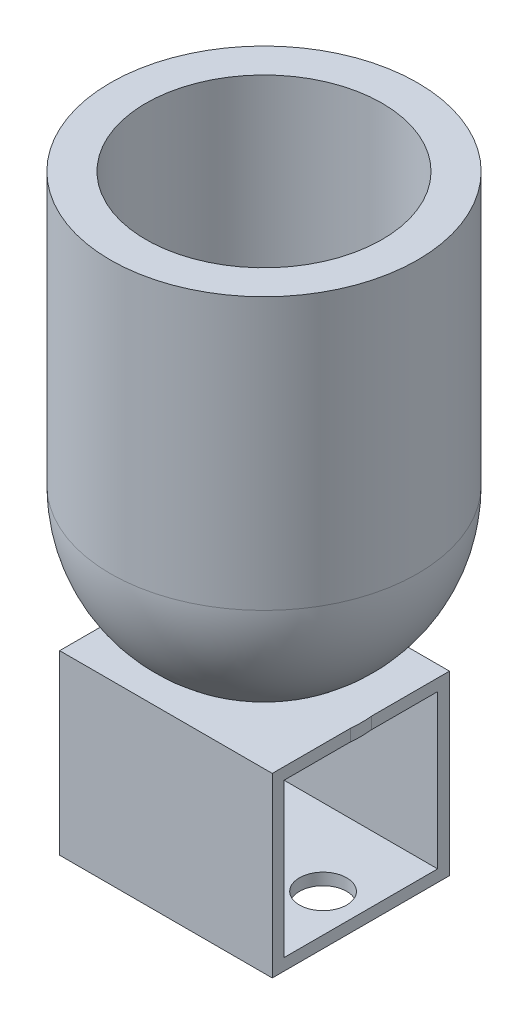
ISO-10303-21;
HEADER;
FILE_DESCRIPTION(('STEP AP214'),'2;1');
FILE_NAME('part.step','',(''),(''),'','','');
FILE_SCHEMA(('AUTOMOTIVE_DESIGN { 1 0 10303 214 1 1 1 1 }'));
ENDSEC;
DATA;
#1=APPLICATION_CONTEXT('core data for automotive mechanical design processes');
#2=APPLICATION_PROTOCOL_DEFINITION('international standard','automotive_design',2000,#1);
#3=PRODUCT_CONTEXT('',#1,'mechanical');
#4=PRODUCT('Part','Part','',(#3));
#5=PRODUCT_RELATED_PRODUCT_CATEGORY('part','',(#4));
#6=PRODUCT_DEFINITION_FORMATION('','',#4);
#7=PRODUCT_DEFINITION_CONTEXT('part definition',#1,'design');
#8=PRODUCT_DEFINITION('design','',#6,#7);
#9=PRODUCT_DEFINITION_SHAPE('','',#8);
#10=(LENGTH_UNIT() NAMED_UNIT(*) SI_UNIT(.MILLI.,.METRE.));
#11=(NAMED_UNIT(*) PLANE_ANGLE_UNIT() SI_UNIT($,.RADIAN.));
#12=(NAMED_UNIT(*) SI_UNIT($,.STERADIAN.) SOLID_ANGLE_UNIT());
#13=UNCERTAINTY_MEASURE_WITH_UNIT(LENGTH_MEASURE(1.E-05),#10,'distance_accuracy_value','');
#14=(GEOMETRIC_REPRESENTATION_CONTEXT(3) GLOBAL_UNCERTAINTY_ASSIGNED_CONTEXT((#13)) GLOBAL_UNIT_ASSIGNED_CONTEXT((#10,
#11,#12)) REPRESENTATION_CONTEXT('',''));
#15=CARTESIAN_POINT('',(0.,0.,0.));
#16=DIRECTION('',(0.,0.,1.));
#17=DIRECTION('',(1.,0.,0.));
#18=AXIS2_PLACEMENT_3D('',#15,#16,#17);
#19=CARTESIAN_POINT('',(0.,0.,0.));
#20=DIRECTION('',(0.,-1.,0.));
#21=DIRECTION('',(0.,0.,-1.));
#22=AXIS2_PLACEMENT_3D('',#19,#20,#21);
#23=CYLINDRICAL_SURFACE('',#22,8.2476041532373);
#24=CARTESIAN_POINT('',(0.,-9.12431284714318,0.));
#25=DIRECTION('',(0.,1.,0.));
#26=DIRECTION('',(0.,0.,1.));
#27=AXIS2_PLACEMENT_3D('',#24,#25,#26);
#28=CIRCLE('',#27,8.2476041532373);
#29=CARTESIAN_POINT('',(8.20010557357962,-9.12431284714318,-0.883879432188361));
#30=VERTEX_POINT('',#29);
#31=CARTESIAN_POINT('',(8.20010557357962,-9.12431284714318,0.883879432188352));
#32=VERTEX_POINT('',#31);
#33=EDGE_CURVE('E61',#30,#32,#28,.F.);
#34=ORIENTED_EDGE('',*,*,#33,.F.);
#35=DIRECTION('',(0.,-1.,0.));
#36=VECTOR('',#35,1.);
#37=CARTESIAN_POINT('',(8.20010557357962,0.,-0.883879432188352));
#38=LINE('',#37,#36);
#39=CARTESIAN_POINT('',(8.20010557357962,-8.12431284714318,-0.883879432188354));
#40=VERTEX_POINT('',#39);
#41=EDGE_CURVE('E219',#40,#30,#38,.T.);
#42=ORIENTED_EDGE('',*,*,#41,.F.);
#43=CARTESIAN_POINT('',(0.,-8.12431284714318,0.));
#44=DIRECTION('',(0.,-1.,0.));
#45=DIRECTION('',(0.,0.,-1.));
#46=AXIS2_PLACEMENT_3D('',#43,#44,#45);
#47=CIRCLE('',#46,8.2476041532373);
#48=CARTESIAN_POINT('',(8.20010557357962,-8.12431284714318,0.883879432188351));
#49=VERTEX_POINT('',#48);
#50=EDGE_CURVE('E230',#40,#49,#47,.T.);
#51=ORIENTED_EDGE('',*,*,#50,.T.);
#52=DIRECTION('',(0.,-1.,0.));
#53=VECTOR('',#52,1.);
#54=CARTESIAN_POINT('',(8.20010557357962,0.,0.883879432188352));
#55=LINE('',#54,#53);
#56=EDGE_CURVE('E223',#32,#49,#55,.F.);
#57=ORIENTED_EDGE('',*,*,#56,.F.);
#58=EDGE_LOOP('',(#34,#42,#51,#57));
#59=FACE_BOUND('',#58,.T.);
#60=ADVANCED_FACE('F43',(#59),#23,.T.);
#61=CARTESIAN_POINT('',(0.,0.,0.));
#62=DIRECTION('',(0.,-1.,0.));
#63=DIRECTION('',(0.,0.,-1.));
#64=AXIS2_PLACEMENT_3D('',#61,#62,#63);
#65=CYLINDRICAL_SURFACE('',#64,2.);
#66=CARTESIAN_POINT('',(0.,-7.68014500949305,0.));
#67=DIRECTION('',(0.,-1.,0.));
#68=DIRECTION('',(0.,0.,-1.));
#69=AXIS2_PLACEMENT_3D('',#66,#67,#68);
#70=CIRCLE('',#69,2.);
#71=CARTESIAN_POINT('',(0.,-7.68014500949305,-2.));
#72=VERTEX_POINT('',#71);
#73=EDGE_CURVE('E11',#72,#72,#70,.T.);
#74=ORIENTED_EDGE('',*,*,#73,.T.);
#75=EDGE_LOOP('',(#74));
#76=FACE_BOUND('',#75,.T.);
#77=CARTESIAN_POINT('',(0.,-8.12431284714318,0.));
#78=DIRECTION('',(0.,-1.,0.));
#79=DIRECTION('',(0.,0.,-1.));
#80=AXIS2_PLACEMENT_3D('',#77,#78,#79);
#81=CIRCLE('',#80,2.);
#82=CARTESIAN_POINT('',(0.,-8.12431284714318,-2.));
#83=VERTEX_POINT('',#82);
#84=EDGE_CURVE('E226',#83,#83,#81,.T.);
#85=ORIENTED_EDGE('',*,*,#84,.F.);
#86=EDGE_LOOP('',(#85));
#87=FACE_BOUND('',#86,.T.);
#88=ADVANCED_FACE('F45',(#76,#87),#65,.T.);
#89=CARTESIAN_POINT('',(0.,5.16508756917208,0.));
#90=DIRECTION('',(0.,-1.,0.));
#91=DIRECTION('',(1.,0.,0.));
#92=AXIS2_PLACEMENT_3D('',#89,#90,#91);
#93=SPHERICAL_SURFACE('',#92,13.);
#94=CARTESIAN_POINT('',(0.,5.16508756917208,0.));
#95=DIRECTION('',(0.,-1.,0.));
#96=DIRECTION('',(0.,0.,-1.));
#97=AXIS2_PLACEMENT_3D('',#94,#95,#96);
#98=CIRCLE('',#97,13.);
#99=CARTESIAN_POINT('',(0.,5.16508756917208,-13.));
#100=VERTEX_POINT('',#99);
#101=EDGE_CURVE('E53',#100,#100,#98,.T.);
#102=ORIENTED_EDGE('',*,*,#101,.T.);
#103=EDGE_LOOP('',(#102));
#104=FACE_BOUND('',#103,.T.);
#105=ORIENTED_EDGE('',*,*,#73,.F.);
#106=EDGE_LOOP('',(#105));
#107=FACE_BOUND('',#106,.T.);
#108=ADVANCED_FACE('F322',(#104,#107),#93,.T.);
#109=CARTESIAN_POINT('',(0.,0.,0.));
#110=DIRECTION('',(0.,-1.,0.));
#111=DIRECTION('',(0.,0.,-1.));
#112=AXIS2_PLACEMENT_3D('',#109,#110,#111);
#113=CYLINDRICAL_SURFACE('',#112,13.);
#114=CARTESIAN_POINT('',(0.,28.1650875691721,0.));
#115=DIRECTION('',(0.,-1.,0.));
#116=DIRECTION('',(0.,0.,-1.));
#117=AXIS2_PLACEMENT_3D('',#114,#115,#116);
#118=CIRCLE('',#117,13.);
#119=CARTESIAN_POINT('',(0.,28.1650875691721,-13.));
#120=VERTEX_POINT('',#119);
#121=EDGE_CURVE('E242',#120,#120,#118,.T.);
#122=ORIENTED_EDGE('',*,*,#121,.T.);
#123=EDGE_LOOP('',(#122));
#124=FACE_BOUND('',#123,.T.);
#125=ORIENTED_EDGE('',*,*,#101,.F.);
#126=EDGE_LOOP('',(#125));
#127=FACE_BOUND('',#126,.T.);
#128=ADVANCED_FACE('F338',(#124,#127),#113,.T.);
#129=CARTESIAN_POINT('',(13.,28.1650875691721,0.));
#130=DIRECTION('',(0.,1.,0.));
#131=DIRECTION('',(0.,0.,1.));
#132=AXIS2_PLACEMENT_3D('',#129,#130,#131);
#133=PLANE('',#132);
#134=CARTESIAN_POINT('',(0.,28.1650875691721,0.));
#135=DIRECTION('',(0.,-1.,0.));
#136=DIRECTION('',(0.,0.,-1.));
#137=AXIS2_PLACEMENT_3D('',#134,#135,#136);
#138=CIRCLE('',#137,10.);
#139=CARTESIAN_POINT('',(0.,28.1650875691721,-10.));
#140=VERTEX_POINT('',#139);
#141=EDGE_CURVE('E238',#140,#140,#138,.T.);
#142=ORIENTED_EDGE('',*,*,#141,.T.);
#143=EDGE_LOOP('',(#142));
#144=FACE_BOUND('',#143,.T.);
#145=ORIENTED_EDGE('',*,*,#121,.F.);
#146=EDGE_LOOP('',(#145));
#147=FACE_BOUND('',#146,.T.);
#148=ADVANCED_FACE('F334',(#144,#147),#133,.T.);
#149=CARTESIAN_POINT('',(0.,0.,0.));
#150=DIRECTION('',(0.,-1.,0.));
#151=DIRECTION('',(0.,0.,-1.));
#152=AXIS2_PLACEMENT_3D('',#149,#150,#151);
#153=CYLINDRICAL_SURFACE('',#152,10.);
#154=CARTESIAN_POINT('',(0.,5.16508756917208,0.));
#155=DIRECTION('',(0.,-1.,0.));
#156=DIRECTION('',(0.,0.,-1.));
#157=AXIS2_PLACEMENT_3D('',#154,#155,#156);
#158=CIRCLE('',#157,10.);
#159=CARTESIAN_POINT('',(0.,5.16508756917208,-10.));
#160=VERTEX_POINT('',#159);
#161=EDGE_CURVE('E234',#160,#160,#158,.T.);
#162=ORIENTED_EDGE('',*,*,#161,.T.);
#163=EDGE_LOOP('',(#162));
#164=FACE_BOUND('',#163,.T.);
#165=ORIENTED_EDGE('',*,*,#141,.F.);
#166=EDGE_LOOP('',(#165));
#167=FACE_BOUND('',#166,.T.);
#168=ADVANCED_FACE('F330',(#164,#167),#153,.F.);
#169=CARTESIAN_POINT('',(0.,5.16508756917208,0.));
#170=DIRECTION('',(0.,-1.,0.));
#171=DIRECTION('',(1.,0.,0.));
#172=AXIS2_PLACEMENT_3D('',#169,#170,#171);
#173=SPHERICAL_SURFACE('',#172,10.);
#174=ORIENTED_EDGE('',*,*,#161,.F.);
#175=EDGE_LOOP('',(#174));
#176=FACE_BOUND('',#175,.T.);
#177=ADVANCED_FACE('F327',(#176),#173,.F.);
#178=CARTESIAN_POINT('',(2.,-8.12431284714318,0.));
#179=DIRECTION('',(0.,1.,0.));
#180=DIRECTION('',(0.,0.,1.));
#181=AXIS2_PLACEMENT_3D('',#178,#179,#180);
#182=PLANE('',#181);
#183=DIRECTION('',(0.,0.,1.));
#184=VECTOR('',#183,1.);
#185=CARTESIAN_POINT('',(8.20010557357962,-8.12431284714318,-6.5));
#186=LINE('',#185,#184);
#187=CARTESIAN_POINT('',(8.20010557357962,-8.12431284714318,-7.5));
#188=VERTEX_POINT('',#187);
#189=EDGE_CURVE('E216',#188,#40,#186,.T.);
#190=ORIENTED_EDGE('',*,*,#189,.F.);
#191=DIRECTION('',(1.,0.,0.));
#192=VECTOR('',#191,1.);
#193=CARTESIAN_POINT('',(-9.79989442642037,-8.12431284714318,-7.5));
#194=LINE('',#193,#192);
#195=CARTESIAN_POINT('',(-9.79989442642037,-8.12431284714318,-7.5));
#196=VERTEX_POINT('',#195);
#197=EDGE_CURVE('E210',#196,#188,#194,.T.);
#198=ORIENTED_EDGE('',*,*,#197,.F.);
#199=DIRECTION('',(0.,0.,-1.));
#200=VECTOR('',#199,1.);
#201=CARTESIAN_POINT('',(-9.79989442642037,-8.12431284714318,7.5));
#202=LINE('',#201,#200);
#203=CARTESIAN_POINT('',(-9.79989442642037,-8.12431284714318,7.5));
#204=VERTEX_POINT('',#203);
#205=EDGE_CURVE('E184',#204,#196,#202,.T.);
#206=ORIENTED_EDGE('',*,*,#205,.F.);
#207=DIRECTION('',(1.,0.,0.));
#208=VECTOR('',#207,1.);
#209=CARTESIAN_POINT('',(-9.79989442642037,-8.12431284714318,7.5));
#210=LINE('',#209,#208);
#211=CARTESIAN_POINT('',(8.20010557357962,-8.12431284714318,7.5));
#212=VERTEX_POINT('',#211);
#213=EDGE_CURVE('E206',#204,#212,#210,.T.);
#214=ORIENTED_EDGE('',*,*,#213,.T.);
#215=EDGE_CURVE('E205',#49,#212,#186,.T.);
#216=ORIENTED_EDGE('',*,*,#215,.F.);
#217=ORIENTED_EDGE('',*,*,#50,.F.);
#218=EDGE_LOOP('',(#190,#198,#206,#214,#216,#217));
#219=FACE_BOUND('',#218,.T.);
#220=ORIENTED_EDGE('',*,*,#84,.T.);
#221=EDGE_LOOP('',(#220));
#222=FACE_BOUND('',#221,.T.);
#223=ADVANCED_FACE('F297',(#219,#222),#182,.T.);
#224=CARTESIAN_POINT('',(8.20010557357962,-8.12431284714318,-6.5));
#225=DIRECTION('',(1.,0.,0.));
#226=DIRECTION('',(0.,0.,-1.));
#227=AXIS2_PLACEMENT_3D('',#224,#225,#226);
#228=PLANE('',#227);
#229=DIRECTION('',(0.,0.,1.));
#230=VECTOR('',#229,1.);
#231=CARTESIAN_POINT('',(8.20010557357962,-9.12431284714318,-6.5));
#232=LINE('',#231,#230);
#233=CARTESIAN_POINT('',(8.20010557357962,-9.12431284714318,-6.5));
#234=VERTEX_POINT('',#233);
#235=EDGE_CURVE('E164',#234,#30,#232,.T.);
#236=ORIENTED_EDGE('',*,*,#235,.F.);
#237=DIRECTION('',(0.,1.,0.));
#238=VECTOR('',#237,1.);
#239=CARTESIAN_POINT('',(8.20010557357962,-8.12431284714318,-6.5));
#240=LINE('',#239,#238);
#241=CARTESIAN_POINT('',(8.20010557357962,-22.1243128471432,-6.5));
#242=VERTEX_POINT('',#241);
#243=EDGE_CURVE('E132',#242,#234,#240,.T.);
#244=ORIENTED_EDGE('',*,*,#243,.F.);
#245=DIRECTION('',(0.,0.,-1.));
#246=VECTOR('',#245,1.);
#247=CARTESIAN_POINT('',(8.20010557357962,-22.1243128471432,-6.5));
#248=LINE('',#247,#246);
#249=CARTESIAN_POINT('',(8.20010557357962,-22.1243128471432,6.5));
#250=VERTEX_POINT('',#249);
#251=EDGE_CURVE('E169',#250,#242,#248,.T.);
#252=ORIENTED_EDGE('',*,*,#251,.F.);
#253=DIRECTION('',(0.,-1.,0.));
#254=VECTOR('',#253,1.);
#255=CARTESIAN_POINT('',(8.20010557357962,-8.12431284714318,6.5));
#256=LINE('',#255,#254);
#257=CARTESIAN_POINT('',(8.20010557357962,-9.12431284714318,6.5));
#258=VERTEX_POINT('',#257);
#259=EDGE_CURVE('E172',#258,#250,#256,.T.);
#260=ORIENTED_EDGE('',*,*,#259,.F.);
#261=EDGE_CURVE('E157',#32,#258,#232,.T.);
#262=ORIENTED_EDGE('',*,*,#261,.F.);
#263=ORIENTED_EDGE('',*,*,#56,.T.);
#264=ORIENTED_EDGE('',*,*,#215,.T.);
#265=DIRECTION('',(0.,-1.,0.));
#266=VECTOR('',#265,1.);
#267=CARTESIAN_POINT('',(8.20010557357962,-8.12431284714318,7.5));
#268=LINE('',#267,#266);
#269=CARTESIAN_POINT('',(8.20010557357962,-23.1243128471432,7.5));
#270=VERTEX_POINT('',#269);
#271=EDGE_CURVE('E181',#212,#270,#268,.T.);
#272=ORIENTED_EDGE('',*,*,#271,.T.);
#273=DIRECTION('',(0.,0.,-1.));
#274=VECTOR('',#273,1.);
#275=CARTESIAN_POINT('',(8.20010557357962,-23.1243128471432,7.5));
#276=LINE('',#275,#274);
#277=CARTESIAN_POINT('',(8.20010557357962,-23.1243128471432,-7.5));
#278=VERTEX_POINT('',#277);
#279=EDGE_CURVE('E175',#270,#278,#276,.T.);
#280=ORIENTED_EDGE('',*,*,#279,.T.);
#281=DIRECTION('',(0.,-1.,0.));
#282=VECTOR('',#281,1.);
#283=CARTESIAN_POINT('',(8.20010557357962,-8.12431284714318,-7.5));
#284=LINE('',#283,#282);
#285=EDGE_CURVE('E195',#188,#278,#284,.T.);
#286=ORIENTED_EDGE('',*,*,#285,.F.);
#287=ORIENTED_EDGE('',*,*,#189,.T.);
#288=ORIENTED_EDGE('',*,*,#41,.T.);
#289=EDGE_LOOP('',(#236,#244,#252,#260,#262,#263,#264,#272,#280,#286,#287,#288));
#290=FACE_BOUND('',#289,.T.);
#291=ADVANCED_FACE('F275',(#290),#228,.T.);
#292=CARTESIAN_POINT('',(-9.79989442642037,-23.1243128471432,7.5));
#293=DIRECTION('',(0.,-1.,0.));
#294=DIRECTION('',(0.,0.,-1.));
#295=AXIS2_PLACEMENT_3D('',#292,#293,#294);
#296=PLANE('',#295);
#297=CARTESIAN_POINT('',(-5.,-23.1243128471432,0.));
#298=DIRECTION('',(0.,-1.,0.));
#299=DIRECTION('',(0.,0.,-1.));
#300=AXIS2_PLACEMENT_3D('',#297,#298,#299);
#301=CIRCLE('',#300,2.);
#302=CARTESIAN_POINT('',(-5.,-23.1243128471432,-2.));
#303=VERTEX_POINT('',#302);
#304=EDGE_CURVE('E251',#303,#303,#301,.T.);
#305=ORIENTED_EDGE('',*,*,#304,.F.);
#306=EDGE_LOOP('',(#305));
#307=FACE_BOUND('',#306,.T.);
#308=CARTESIAN_POINT('',(5.,-23.1243128471432,0.));
#309=DIRECTION('',(0.,-1.,0.));
#310=DIRECTION('',(0.,0.,-1.));
#311=AXIS2_PLACEMENT_3D('',#308,#309,#310);
#312=CIRCLE('',#311,2.);
#313=CARTESIAN_POINT('',(5.,-23.1243128471432,-2.));
#314=VERTEX_POINT('',#313);
#315=EDGE_CURVE('E258',#314,#314,#312,.T.);
#316=ORIENTED_EDGE('',*,*,#315,.F.);
#317=EDGE_LOOP('',(#316));
#318=FACE_BOUND('',#317,.T.);
#319=ORIENTED_EDGE('',*,*,#279,.F.);
#320=DIRECTION('',(1.,0.,0.));
#321=VECTOR('',#320,1.);
#322=CARTESIAN_POINT('',(-9.79989442642037,-23.1243128471432,7.5));
#323=LINE('',#322,#321);
#324=CARTESIAN_POINT('',(-9.79989442642037,-23.1243128471432,7.5));
#325=VERTEX_POINT('',#324);
#326=EDGE_CURVE('E202',#325,#270,#323,.T.);
#327=ORIENTED_EDGE('',*,*,#326,.F.);
#328=DIRECTION('',(0.,0.,-1.));
#329=VECTOR('',#328,1.);
#330=CARTESIAN_POINT('',(-9.79989442642037,-23.1243128471432,7.5));
#331=LINE('',#330,#329);
#332=CARTESIAN_POINT('',(-9.79989442642037,-23.1243128471432,-7.5));
#333=VERTEX_POINT('',#332);
#334=EDGE_CURVE('E176',#325,#333,#331,.T.);
#335=ORIENTED_EDGE('',*,*,#334,.T.);
#336=DIRECTION('',(1.,0.,0.));
#337=VECTOR('',#336,1.);
#338=CARTESIAN_POINT('',(-9.79989442642037,-23.1243128471432,-7.5));
#339=LINE('',#338,#337);
#340=EDGE_CURVE('E191',#333,#278,#339,.T.);
#341=ORIENTED_EDGE('',*,*,#340,.T.);
#342=EDGE_LOOP('',(#319,#327,#335,#341));
#343=FACE_BOUND('',#342,.T.);
#344=ADVANCED_FACE('F271',(#307,#318,#343),#296,.T.);
#345=CARTESIAN_POINT('',(-9.79989442642037,-8.12431284714318,7.5));
#346=DIRECTION('',(0.,0.,1.));
#347=DIRECTION('',(0.,-1.,0.));
#348=AXIS2_PLACEMENT_3D('',#345,#346,#347);
#349=PLANE('',#348);
#350=ORIENTED_EDGE('',*,*,#271,.F.);
#351=ORIENTED_EDGE('',*,*,#213,.F.);
#352=DIRECTION('',(0.,-1.,0.));
#353=VECTOR('',#352,1.);
#354=CARTESIAN_POINT('',(-9.79989442642037,-8.12431284714318,7.5));
#355=LINE('',#354,#353);
#356=EDGE_CURVE('E187',#204,#325,#355,.T.);
#357=ORIENTED_EDGE('',*,*,#356,.T.);
#358=ORIENTED_EDGE('',*,*,#326,.T.);
#359=EDGE_LOOP('',(#350,#351,#357,#358));
#360=FACE_BOUND('',#359,.T.);
#361=ADVANCED_FACE('F274',(#360),#349,.T.);
#362=CARTESIAN_POINT('',(-9.79989442642037,-8.12431284714318,-7.5));
#363=DIRECTION('',(0.,0.,1.));
#364=DIRECTION('',(1.,0.,0.));
#365=AXIS2_PLACEMENT_3D('',#362,#363,#364);
#366=PLANE('',#365);
#367=ORIENTED_EDGE('',*,*,#285,.T.);
#368=ORIENTED_EDGE('',*,*,#340,.F.);
#369=DIRECTION('',(0.,-1.,0.));
#370=VECTOR('',#369,1.);
#371=CARTESIAN_POINT('',(-9.79989442642037,-8.12431284714318,-7.5));
#372=LINE('',#371,#370);
#373=EDGE_CURVE('E180',#196,#333,#372,.T.);
#374=ORIENTED_EDGE('',*,*,#373,.F.);
#375=ORIENTED_EDGE('',*,*,#197,.T.);
#376=EDGE_LOOP('',(#367,#368,#374,#375));
#377=FACE_BOUND('',#376,.T.);
#378=ADVANCED_FACE('F291',(#377),#366,.F.);
#379=CARTESIAN_POINT('',(-9.79989442642037,0.,0.));
#380=DIRECTION('',(-1.,0.,0.));
#381=DIRECTION('',(0.,0.,1.));
#382=AXIS2_PLACEMENT_3D('',#379,#380,#381);
#383=PLANE('',#382);
#384=DIRECTION('',(0.,1.,0.));
#385=VECTOR('',#384,1.);
#386=CARTESIAN_POINT('',(-9.79989442642037,-22.1243128471432,6.5));
#387=LINE('',#386,#385);
#388=CARTESIAN_POINT('',(-9.79989442642037,-22.1243128471432,6.5));
#389=VERTEX_POINT('',#388);
#390=CARTESIAN_POINT('',(-9.79989442642037,-9.12431284714318,6.5));
#391=VERTEX_POINT('',#390);
#392=EDGE_CURVE('E69',#389,#391,#387,.T.);
#393=ORIENTED_EDGE('',*,*,#392,.F.);
#394=DIRECTION('',(0.,0.,1.));
#395=VECTOR('',#394,1.);
#396=CARTESIAN_POINT('',(-9.79989442642037,-22.1243128471432,-6.5));
#397=LINE('',#396,#395);
#398=CARTESIAN_POINT('',(-9.79989442642037,-22.1243128471432,-6.5));
#399=VERTEX_POINT('',#398);
#400=EDGE_CURVE('E147',#399,#389,#397,.T.);
#401=ORIENTED_EDGE('',*,*,#400,.F.);
#402=DIRECTION('',(0.,-1.,0.));
#403=VECTOR('',#402,1.);
#404=CARTESIAN_POINT('',(-9.79989442642037,-22.1243128471432,-6.5));
#405=LINE('',#404,#403);
#406=CARTESIAN_POINT('',(-9.79989442642037,-9.12431284714318,-6.5));
#407=VERTEX_POINT('',#406);
#408=EDGE_CURVE('E129',#407,#399,#405,.T.);
#409=ORIENTED_EDGE('',*,*,#408,.F.);
#410=DIRECTION('',(0.,0.,-1.));
#411=VECTOR('',#410,1.);
#412=CARTESIAN_POINT('',(-9.79989442642037,-9.12431284714318,-6.5));
#413=LINE('',#412,#411);
#414=EDGE_CURVE('E139',#391,#407,#413,.T.);
#415=ORIENTED_EDGE('',*,*,#414,.F.);
#416=EDGE_LOOP('',(#393,#401,#409,#415));
#417=FACE_BOUND('',#416,.T.);
#418=ORIENTED_EDGE('',*,*,#334,.F.);
#419=ORIENTED_EDGE('',*,*,#356,.F.);
#420=ORIENTED_EDGE('',*,*,#205,.T.);
#421=ORIENTED_EDGE('',*,*,#373,.T.);
#422=EDGE_LOOP('',(#418,#419,#420,#421));
#423=FACE_BOUND('',#422,.T.);
#424=ADVANCED_FACE('F144',(#417,#423),#383,.T.);
#425=CARTESIAN_POINT('',(10.2001055735796,-22.1243128471432,6.5));
#426=DIRECTION('',(0.,0.,1.));
#427=DIRECTION('',(1.,0.,0.));
#428=AXIS2_PLACEMENT_3D('',#425,#426,#427);
#429=PLANE('',#428);
#430=ORIENTED_EDGE('',*,*,#259,.T.);
#431=DIRECTION('',(-1.,0.,0.));
#432=VECTOR('',#431,1.);
#433=CARTESIAN_POINT('',(10.2001055735796,-22.1243128471432,6.5));
#434=LINE('',#433,#432);
#435=EDGE_CURVE('E154',#250,#389,#434,.T.);
#436=ORIENTED_EDGE('',*,*,#435,.T.);
#437=ORIENTED_EDGE('',*,*,#392,.T.);
#438=DIRECTION('',(-1.,0.,0.));
#439=VECTOR('',#438,1.);
#440=CARTESIAN_POINT('',(10.2001055735796,-9.12431284714318,6.5));
#441=LINE('',#440,#439);
#442=EDGE_CURVE('E136',#258,#391,#441,.T.);
#443=ORIENTED_EDGE('',*,*,#442,.F.);
#444=EDGE_LOOP('',(#430,#436,#437,#443));
#445=FACE_BOUND('',#444,.T.);
#446=ADVANCED_FACE('F306',(#445),#429,.F.);
#447=CARTESIAN_POINT('',(10.2001055735796,-22.1243128471432,-6.5));
#448=DIRECTION('',(0.,-1.,0.));
#449=DIRECTION('',(0.,0.,-1.));
#450=AXIS2_PLACEMENT_3D('',#447,#448,#449);
#451=PLANE('',#450);
#452=CARTESIAN_POINT('',(-5.,-22.1243128471432,0.));
#453=DIRECTION('',(0.,-1.,0.));
#454=DIRECTION('',(0.,0.,-1.));
#455=AXIS2_PLACEMENT_3D('',#452,#453,#454);
#456=CIRCLE('',#455,2.);
#457=CARTESIAN_POINT('',(-5.,-22.1243128471432,-2.));
#458=VERTEX_POINT('',#457);
#459=EDGE_CURVE('E47',#458,#458,#456,.T.);
#460=ORIENTED_EDGE('',*,*,#459,.T.);
#461=EDGE_LOOP('',(#460));
#462=FACE_BOUND('',#461,.T.);
#463=CARTESIAN_POINT('',(5.,-22.1243128471432,0.));
#464=DIRECTION('',(0.,-1.,0.));
#465=DIRECTION('',(0.,0.,-1.));
#466=AXIS2_PLACEMENT_3D('',#463,#464,#465);
#467=CIRCLE('',#466,2.);
#468=CARTESIAN_POINT('',(5.,-22.1243128471432,-2.));
#469=VERTEX_POINT('',#468);
#470=EDGE_CURVE('E248',#469,#469,#467,.T.);
#471=ORIENTED_EDGE('',*,*,#470,.T.);
#472=EDGE_LOOP('',(#471));
#473=FACE_BOUND('',#472,.T.);
#474=ORIENTED_EDGE('',*,*,#251,.T.);
#475=DIRECTION('',(-1.,0.,0.));
#476=VECTOR('',#475,1.);
#477=CARTESIAN_POINT('',(10.2001055735796,-22.1243128471432,-6.5));
#478=LINE('',#477,#476);
#479=EDGE_CURVE('E135',#242,#399,#478,.T.);
#480=ORIENTED_EDGE('',*,*,#479,.T.);
#481=ORIENTED_EDGE('',*,*,#400,.T.);
#482=ORIENTED_EDGE('',*,*,#435,.F.);
#483=EDGE_LOOP('',(#474,#480,#481,#482));
#484=FACE_BOUND('',#483,.T.);
#485=ADVANCED_FACE('F305',(#462,#473,#484),#451,.F.);
#486=CARTESIAN_POINT('',(10.2001055735796,-22.1243128471432,-6.5));
#487=DIRECTION('',(0.,0.,-1.));
#488=DIRECTION('',(-1.,0.,0.));
#489=AXIS2_PLACEMENT_3D('',#486,#487,#488);
#490=PLANE('',#489);
#491=ORIENTED_EDGE('',*,*,#243,.T.);
#492=DIRECTION('',(-1.,0.,0.));
#493=VECTOR('',#492,1.);
#494=CARTESIAN_POINT('',(10.2001055735796,-9.12431284714318,-6.5));
#495=LINE('',#494,#493);
#496=EDGE_CURVE('E124',#234,#407,#495,.T.);
#497=ORIENTED_EDGE('',*,*,#496,.T.);
#498=ORIENTED_EDGE('',*,*,#408,.T.);
#499=ORIENTED_EDGE('',*,*,#479,.F.);
#500=EDGE_LOOP('',(#491,#497,#498,#499));
#501=FACE_BOUND('',#500,.T.);
#502=ADVANCED_FACE('F126',(#501),#490,.F.);
#503=CARTESIAN_POINT('',(10.2001055735796,-9.12431284714318,-6.5));
#504=DIRECTION('',(0.,1.,0.));
#505=DIRECTION('',(0.,0.,1.));
#506=AXIS2_PLACEMENT_3D('',#503,#504,#505);
#507=PLANE('',#506);
#508=ORIENTED_EDGE('',*,*,#235,.T.);
#509=ORIENTED_EDGE('',*,*,#33,.T.);
#510=ORIENTED_EDGE('',*,*,#261,.T.);
#511=ORIENTED_EDGE('',*,*,#442,.T.);
#512=ORIENTED_EDGE('',*,*,#414,.T.);
#513=ORIENTED_EDGE('',*,*,#496,.F.);
#514=EDGE_LOOP('',(#508,#509,#510,#511,#512,#513));
#515=FACE_BOUND('',#514,.T.);
#516=ADVANCED_FACE('F140',(#515),#507,.F.);
#517=CARTESIAN_POINT('',(5.,-18.1243128471432,0.));
#518=DIRECTION('',(0.,-1.,0.));
#519=DIRECTION('',(0.,0.,-1.));
#520=AXIS2_PLACEMENT_3D('',#517,#518,#519);
#521=CYLINDRICAL_SURFACE('',#520,2.);
#522=ORIENTED_EDGE('',*,*,#315,.T.);
#523=EDGE_LOOP('',(#522));
#524=FACE_BOUND('',#523,.T.);
#525=ORIENTED_EDGE('',*,*,#470,.F.);
#526=EDGE_LOOP('',(#525));
#527=FACE_BOUND('',#526,.T.);
#528=ADVANCED_FACE('F268',(#524,#527),#521,.F.);
#529=CARTESIAN_POINT('',(-5.,-18.1243128471432,0.));
#530=DIRECTION('',(0.,-1.,0.));
#531=DIRECTION('',(0.,0.,-1.));
#532=AXIS2_PLACEMENT_3D('',#529,#530,#531);
#533=CYLINDRICAL_SURFACE('',#532,2.);
#534=ORIENTED_EDGE('',*,*,#304,.T.);
#535=EDGE_LOOP('',(#534));
#536=FACE_BOUND('',#535,.T.);
#537=ORIENTED_EDGE('',*,*,#459,.F.);
#538=EDGE_LOOP('',(#537));
#539=FACE_BOUND('',#538,.T.);
#540=ADVANCED_FACE('F419',(#536,#539),#533,.F.);
#541=CLOSED_SHELL('',(#60,#88,#108,#128,#148,#168,#177,#223,#291,#344,#361,#378,#424,#446,#485,
#502,#516,#528,#540));
#542=MANIFOLD_SOLID_BREP('B2',#541);
#543=ADVANCED_BREP_SHAPE_REPRESENTATION('',(#18,#542),#14);
#544=SHAPE_DEFINITION_REPRESENTATION(#9,#543);
ENDSEC;
END-ISO-10303-21;
